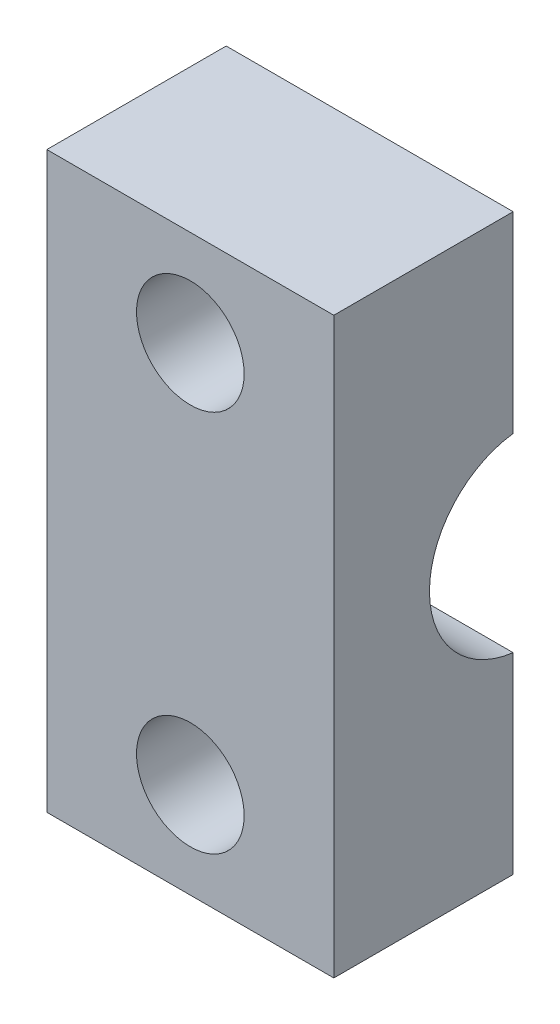
ISO-10303-21;
HEADER;
FILE_DESCRIPTION(('STEP AP214'),'2;1');
FILE_NAME('part.step','',(''),(''),'','','');
FILE_SCHEMA(('AUTOMOTIVE_DESIGN { 1 0 10303 214 1 1 1 1 }'));
ENDSEC;
DATA;
#1=APPLICATION_CONTEXT('core data for automotive mechanical design processes');
#2=APPLICATION_PROTOCOL_DEFINITION('international standard','automotive_design',2000,#1);
#3=PRODUCT_CONTEXT('',#1,'mechanical');
#4=PRODUCT('Part','Part','',(#3));
#5=PRODUCT_RELATED_PRODUCT_CATEGORY('part','',(#4));
#6=PRODUCT_DEFINITION_FORMATION('','',#4);
#7=PRODUCT_DEFINITION_CONTEXT('part definition',#1,'design');
#8=PRODUCT_DEFINITION('design','',#6,#7);
#9=PRODUCT_DEFINITION_SHAPE('','',#8);
#10=(LENGTH_UNIT() NAMED_UNIT(*) SI_UNIT(.MILLI.,.METRE.));
#11=(NAMED_UNIT(*) PLANE_ANGLE_UNIT() SI_UNIT($,.RADIAN.));
#12=(NAMED_UNIT(*) SI_UNIT($,.STERADIAN.) SOLID_ANGLE_UNIT());
#13=UNCERTAINTY_MEASURE_WITH_UNIT(LENGTH_MEASURE(1.E-05),#10,'distance_accuracy_value','');
#14=(GEOMETRIC_REPRESENTATION_CONTEXT(3) GLOBAL_UNCERTAINTY_ASSIGNED_CONTEXT((#13)) GLOBAL_UNIT_ASSIGNED_CONTEXT((#10,
#11,#12)) REPRESENTATION_CONTEXT('',''));
#15=CARTESIAN_POINT('',(0.,0.,0.));
#16=DIRECTION('',(0.,0.,1.));
#17=DIRECTION('',(1.,0.,0.));
#18=AXIS2_PLACEMENT_3D('',#15,#16,#17);
#19=CARTESIAN_POINT('',(12.,-12.,0.));
#20=DIRECTION('',(0.,1.,0.));
#21=DIRECTION('',(0.,0.,1.));
#22=AXIS2_PLACEMENT_3D('',#19,#20,#21);
#23=PLANE('',#22);
#24=DIRECTION('',(-1.,0.,0.));
#25=VECTOR('',#24,1.);
#26=CARTESIAN_POINT('',(12.,-12.,-7.49999999999999));
#27=LINE('',#26,#25);
#28=CARTESIAN_POINT('',(12.,-12.,-7.49999999999999));
#29=VERTEX_POINT('',#28);
#30=CARTESIAN_POINT('',(0.,-12.,-7.5));
#31=VERTEX_POINT('',#30);
#32=EDGE_CURVE('E48',#29,#31,#27,.T.);
#33=ORIENTED_EDGE('',*,*,#32,.F.);
#34=DIRECTION('',(0.,0.,-1.));
#35=VECTOR('',#34,1.);
#36=CARTESIAN_POINT('',(12.,-12.,0.));
#37=LINE('',#36,#35);
#38=CARTESIAN_POINT('',(12.,-12.,0.));
#39=VERTEX_POINT('',#38);
#40=EDGE_CURVE('E96',#39,#29,#37,.T.);
#41=ORIENTED_EDGE('',*,*,#40,.F.);
#42=DIRECTION('',(-1.,0.,0.));
#43=VECTOR('',#42,1.);
#44=CARTESIAN_POINT('',(12.,-12.,0.));
#45=LINE('',#44,#43);
#46=CARTESIAN_POINT('',(0.,-12.,0.));
#47=VERTEX_POINT('',#46);
#48=EDGE_CURVE('E11',#39,#47,#45,.T.);
#49=ORIENTED_EDGE('',*,*,#48,.T.);
#50=DIRECTION('',(0.,0.,-1.));
#51=VECTOR('',#50,1.);
#52=CARTESIAN_POINT('',(0.,-12.,0.));
#53=LINE('',#52,#51);
#54=EDGE_CURVE('E98',#47,#31,#53,.T.);
#55=ORIENTED_EDGE('',*,*,#54,.T.);
#56=EDGE_LOOP('',(#33,#41,#49,#55));
#57=FACE_BOUND('',#56,.T.);
#58=ADVANCED_FACE('F32',(#57),#23,.F.);
#59=CARTESIAN_POINT('',(12.,0.,-8.));
#60=DIRECTION('',(-1.,0.,0.));
#61=DIRECTION('',(0.,0.,1.));
#62=AXIS2_PLACEMENT_3D('',#59,#60,#61);
#63=CYLINDRICAL_SURFACE('',#62,4.);
#64=DIRECTION('',(-1.,0.,0.));
#65=VECTOR('',#64,1.);
#66=CARTESIAN_POINT('',(12.,-3.96862696659689,-7.49999999999999));
#67=LINE('',#66,#65);
#68=CARTESIAN_POINT('',(0.,-3.96862696659689,-7.49999999999999));
#69=VERTEX_POINT('',#68);
#70=CARTESIAN_POINT('',(12.,-3.96862696659689,-7.49999999999999));
#71=VERTEX_POINT('',#70);
#72=EDGE_CURVE('E87',#69,#71,#67,.F.);
#73=ORIENTED_EDGE('',*,*,#72,.F.);
#74=CARTESIAN_POINT('',(0.,0.,-8.));
#75=DIRECTION('',(-1.,0.,0.));
#76=DIRECTION('',(0.,0.,-1.));
#77=AXIS2_PLACEMENT_3D('',#74,#75,#76);
#78=CIRCLE('',#77,4.);
#79=CARTESIAN_POINT('',(0.,3.96862696659689,-7.5));
#80=VERTEX_POINT('',#79);
#81=EDGE_CURVE('E119',#69,#80,#78,.T.);
#82=ORIENTED_EDGE('',*,*,#81,.T.);
#83=DIRECTION('',(-1.,0.,0.));
#84=VECTOR('',#83,1.);
#85=CARTESIAN_POINT('',(12.,3.96862696659689,-7.5));
#86=LINE('',#85,#84);
#87=CARTESIAN_POINT('',(12.,3.96862696659689,-7.5));
#88=VERTEX_POINT('',#87);
#89=EDGE_CURVE('E56',#88,#80,#86,.T.);
#90=ORIENTED_EDGE('',*,*,#89,.F.);
#91=CARTESIAN_POINT('',(12.,0.,-8.));
#92=DIRECTION('',(-1.,0.,0.));
#93=DIRECTION('',(0.,0.,-1.));
#94=AXIS2_PLACEMENT_3D('',#91,#92,#93);
#95=CIRCLE('',#94,4.);
#96=EDGE_CURVE('E105',#71,#88,#95,.T.);
#97=ORIENTED_EDGE('',*,*,#96,.F.);
#98=EDGE_LOOP('',(#73,#82,#90,#97));
#99=FACE_BOUND('',#98,.T.);
#100=ADVANCED_FACE('F165',(#99),#63,.F.);
#101=CARTESIAN_POINT('',(12.,12.,0.));
#102=DIRECTION('',(0.,-1.,0.));
#103=DIRECTION('',(0.,0.,-1.));
#104=AXIS2_PLACEMENT_3D('',#101,#102,#103);
#105=PLANE('',#104);
#106=DIRECTION('',(1.,0.,0.));
#107=VECTOR('',#106,1.);
#108=CARTESIAN_POINT('',(12.,12.,-7.50000000000001));
#109=LINE('',#108,#107);
#110=CARTESIAN_POINT('',(0.,12.,-7.50000000000001));
#111=VERTEX_POINT('',#110);
#112=CARTESIAN_POINT('',(12.,12.,-7.50000000000001));
#113=VERTEX_POINT('',#112);
#114=EDGE_CURVE('E134',#111,#113,#109,.T.);
#115=ORIENTED_EDGE('',*,*,#114,.F.);
#116=DIRECTION('',(0.,0.,1.));
#117=VECTOR('',#116,1.);
#118=CARTESIAN_POINT('',(0.,12.,0.));
#119=LINE('',#118,#117);
#120=CARTESIAN_POINT('',(0.,12.,0.));
#121=VERTEX_POINT('',#120);
#122=EDGE_CURVE('E109',#111,#121,#119,.T.);
#123=ORIENTED_EDGE('',*,*,#122,.T.);
#124=DIRECTION('',(-1.,0.,0.));
#125=VECTOR('',#124,1.);
#126=CARTESIAN_POINT('',(12.,12.,0.));
#127=LINE('',#126,#125);
#128=CARTESIAN_POINT('',(12.,12.,0.));
#129=VERTEX_POINT('',#128);
#130=EDGE_CURVE('E41',#129,#121,#127,.T.);
#131=ORIENTED_EDGE('',*,*,#130,.F.);
#132=DIRECTION('',(0.,0.,1.));
#133=VECTOR('',#132,1.);
#134=CARTESIAN_POINT('',(12.,12.,0.));
#135=LINE('',#134,#133);
#136=EDGE_CURVE('E107',#113,#129,#135,.T.);
#137=ORIENTED_EDGE('',*,*,#136,.F.);
#138=EDGE_LOOP('',(#115,#123,#131,#137));
#139=FACE_BOUND('',#138,.T.);
#140=ADVANCED_FACE('F169',(#139),#105,.F.);
#141=CARTESIAN_POINT('',(12.,0.,-8.));
#142=DIRECTION('',(1.,0.,0.));
#143=DIRECTION('',(0.,0.,-1.));
#144=AXIS2_PLACEMENT_3D('',#141,#142,#143);
#145=PLANE('',#144);
#146=ORIENTED_EDGE('',*,*,#40,.T.);
#147=DIRECTION('',(0.,-1.,0.));
#148=VECTOR('',#147,1.);
#149=CARTESIAN_POINT('',(12.,12.,-7.50000000000001));
#150=LINE('',#149,#148);
#151=EDGE_CURVE('E84',#71,#29,#150,.T.);
#152=ORIENTED_EDGE('',*,*,#151,.F.);
#153=ORIENTED_EDGE('',*,*,#96,.T.);
#154=EDGE_CURVE('E92',#113,#88,#150,.T.);
#155=ORIENTED_EDGE('',*,*,#154,.F.);
#156=ORIENTED_EDGE('',*,*,#136,.T.);
#157=DIRECTION('',(0.,-1.,0.));
#158=VECTOR('',#157,1.);
#159=CARTESIAN_POINT('',(12.,12.,0.));
#160=LINE('',#159,#158);
#161=EDGE_CURVE('E103',#129,#39,#160,.T.);
#162=ORIENTED_EDGE('',*,*,#161,.T.);
#163=EDGE_LOOP('',(#146,#152,#153,#155,#156,#162));
#164=FACE_BOUND('',#163,.T.);
#165=ADVANCED_FACE('F101',(#164),#145,.T.);
#166=CARTESIAN_POINT('',(0.,0.,-8.));
#167=DIRECTION('',(1.,0.,0.));
#168=DIRECTION('',(0.,0.,-1.));
#169=AXIS2_PLACEMENT_3D('',#166,#167,#168);
#170=PLANE('',#169);
#171=DIRECTION('',(0.,1.,0.));
#172=VECTOR('',#171,1.);
#173=CARTESIAN_POINT('',(0.,12.,-7.50000000000001));
#174=LINE('',#173,#172);
#175=EDGE_CURVE('E133',#31,#69,#174,.T.);
#176=ORIENTED_EDGE('',*,*,#175,.F.);
#177=ORIENTED_EDGE('',*,*,#54,.F.);
#178=DIRECTION('',(0.,-1.,0.));
#179=VECTOR('',#178,1.);
#180=CARTESIAN_POINT('',(0.,12.,0.));
#181=LINE('',#180,#179);
#182=EDGE_CURVE('E114',#121,#47,#181,.T.);
#183=ORIENTED_EDGE('',*,*,#182,.F.);
#184=ORIENTED_EDGE('',*,*,#122,.F.);
#185=EDGE_CURVE('E99',#80,#111,#174,.T.);
#186=ORIENTED_EDGE('',*,*,#185,.F.);
#187=ORIENTED_EDGE('',*,*,#81,.F.);
#188=EDGE_LOOP('',(#176,#177,#183,#184,#186,#187));
#189=FACE_BOUND('',#188,.T.);
#190=ADVANCED_FACE('F131',(#189),#170,.F.);
#191=CARTESIAN_POINT('',(6.,8.,-8.));
#192=DIRECTION('',(0.,0.,1.));
#193=DIRECTION('',(1.,0.,0.));
#194=AXIS2_PLACEMENT_3D('',#191,#192,#193);
#195=CYLINDRICAL_SURFACE('',#194,2.25);
#196=CARTESIAN_POINT('',(6.,8.,0.));
#197=DIRECTION('',(0.,0.,1.));
#198=DIRECTION('',(1.,0.,0.));
#199=AXIS2_PLACEMENT_3D('',#196,#197,#198);
#200=CIRCLE('',#199,2.25);
#201=CARTESIAN_POINT('',(8.25,8.,0.));
#202=VERTEX_POINT('',#201);
#203=EDGE_CURVE('E117',#202,#202,#200,.T.);
#204=ORIENTED_EDGE('',*,*,#203,.T.);
#205=EDGE_LOOP('',(#204));
#206=FACE_BOUND('',#205,.T.);
#207=CARTESIAN_POINT('',(6.,8.,-7.5));
#208=DIRECTION('',(0.,0.,-1.));
#209=DIRECTION('',(0.,1.,0.));
#210=AXIS2_PLACEMENT_3D('',#207,#208,#209);
#211=CIRCLE('',#210,2.25);
#212=CARTESIAN_POINT('',(6.,10.25,-7.5));
#213=VERTEX_POINT('',#212);
#214=EDGE_CURVE('E138',#213,#213,#211,.F.);
#215=ORIENTED_EDGE('',*,*,#214,.F.);
#216=EDGE_LOOP('',(#215));
#217=FACE_BOUND('',#216,.T.);
#218=ADVANCED_FACE('F148',(#206,#217),#195,.F.);
#219=CARTESIAN_POINT('',(6.,-8.,-8.));
#220=DIRECTION('',(0.,0.,1.));
#221=DIRECTION('',(1.,0.,0.));
#222=AXIS2_PLACEMENT_3D('',#219,#220,#221);
#223=CYLINDRICAL_SURFACE('',#222,2.25);
#224=CARTESIAN_POINT('',(6.,-8.,0.));
#225=DIRECTION('',(0.,0.,1.));
#226=DIRECTION('',(1.,0.,0.));
#227=AXIS2_PLACEMENT_3D('',#224,#225,#226);
#228=CIRCLE('',#227,2.25);
#229=CARTESIAN_POINT('',(8.25,-8.,0.));
#230=VERTEX_POINT('',#229);
#231=EDGE_CURVE('E143',#230,#230,#228,.T.);
#232=ORIENTED_EDGE('',*,*,#231,.T.);
#233=EDGE_LOOP('',(#232));
#234=FACE_BOUND('',#233,.T.);
#235=CARTESIAN_POINT('',(6.,-8.,-7.49999999999999));
#236=DIRECTION('',(0.,0.,-1.));
#237=DIRECTION('',(0.,1.,0.));
#238=AXIS2_PLACEMENT_3D('',#235,#236,#237);
#239=CIRCLE('',#238,2.25);
#240=CARTESIAN_POINT('',(6.,-5.75,-7.49999999999999));
#241=VERTEX_POINT('',#240);
#242=EDGE_CURVE('E36',#241,#241,#239,.F.);
#243=ORIENTED_EDGE('',*,*,#242,.F.);
#244=EDGE_LOOP('',(#243));
#245=FACE_BOUND('',#244,.T.);
#246=ADVANCED_FACE('F152',(#234,#245),#223,.F.);
#247=CARTESIAN_POINT('',(12.,12.,0.));
#248=DIRECTION('',(0.,0.,-1.));
#249=DIRECTION('',(-1.,0.,0.));
#250=AXIS2_PLACEMENT_3D('',#247,#248,#249);
#251=PLANE('',#250);
#252=ORIENTED_EDGE('',*,*,#231,.F.);
#253=EDGE_LOOP('',(#252));
#254=FACE_BOUND('',#253,.T.);
#255=ORIENTED_EDGE('',*,*,#203,.F.);
#256=EDGE_LOOP('',(#255));
#257=FACE_BOUND('',#256,.T.);
#258=ORIENTED_EDGE('',*,*,#182,.T.);
#259=ORIENTED_EDGE('',*,*,#48,.F.);
#260=ORIENTED_EDGE('',*,*,#161,.F.);
#261=ORIENTED_EDGE('',*,*,#130,.T.);
#262=EDGE_LOOP('',(#258,#259,#260,#261));
#263=FACE_BOUND('',#262,.T.);
#264=ADVANCED_FACE('F34',(#254,#257,#263),#251,.F.);
#265=CARTESIAN_POINT('',(0.,0.,-7.5));
#266=DIRECTION('',(0.,0.,-1.));
#267=DIRECTION('',(0.,1.,0.));
#268=AXIS2_PLACEMENT_3D('',#265,#266,#267);
#269=PLANE('',#268);
#270=ORIENTED_EDGE('',*,*,#242,.T.);
#271=EDGE_LOOP('',(#270));
#272=FACE_BOUND('',#271,.T.);
#273=ORIENTED_EDGE('',*,*,#72,.T.);
#274=ORIENTED_EDGE('',*,*,#151,.T.);
#275=ORIENTED_EDGE('',*,*,#32,.T.);
#276=ORIENTED_EDGE('',*,*,#175,.T.);
#277=EDGE_LOOP('',(#273,#274,#275,#276));
#278=FACE_BOUND('',#277,.T.);
#279=ADVANCED_FACE('F85',(#272,#278),#269,.T.);
#280=ORIENTED_EDGE('',*,*,#214,.T.);
#281=EDGE_LOOP('',(#280));
#282=FACE_BOUND('',#281,.T.);
#283=ORIENTED_EDGE('',*,*,#89,.T.);
#284=ORIENTED_EDGE('',*,*,#185,.T.);
#285=ORIENTED_EDGE('',*,*,#114,.T.);
#286=ORIENTED_EDGE('',*,*,#154,.T.);
#287=EDGE_LOOP('',(#283,#284,#285,#286));
#288=FACE_BOUND('',#287,.T.);
#289=ADVANCED_FACE('F158',(#282,#288),#269,.T.);
#290=CLOSED_SHELL('',(#58,#100,#140,#165,#190,#218,#246,#264,#279,#289));
#291=MANIFOLD_SOLID_BREP('B2',#290);
#292=ADVANCED_BREP_SHAPE_REPRESENTATION('',(#18,#291),#14);
#293=SHAPE_DEFINITION_REPRESENTATION(#9,#292);
ENDSEC;
END-ISO-10303-21;
